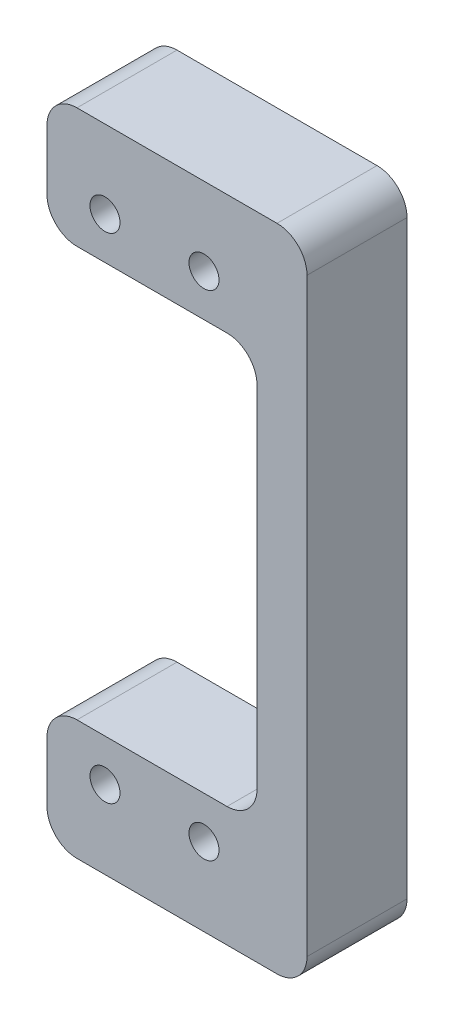
ISO-10303-21;
HEADER;
FILE_DESCRIPTION(('STEP AP214'),'2;1');
FILE_NAME('part.step','',(''),(''),'','','');
FILE_SCHEMA(('AUTOMOTIVE_DESIGN { 1 0 10303 214 1 1 1 1 }'));
ENDSEC;
DATA;
#1=APPLICATION_CONTEXT('core data for automotive mechanical design processes');
#2=APPLICATION_PROTOCOL_DEFINITION('international standard','automotive_design',2000,#1);
#3=PRODUCT_CONTEXT('',#1,'mechanical');
#4=PRODUCT('Part','Part','',(#3));
#5=PRODUCT_RELATED_PRODUCT_CATEGORY('part','',(#4));
#6=PRODUCT_DEFINITION_FORMATION('','',#4);
#7=PRODUCT_DEFINITION_CONTEXT('part definition',#1,'design');
#8=PRODUCT_DEFINITION('design','',#6,#7);
#9=PRODUCT_DEFINITION_SHAPE('','',#8);
#10=(LENGTH_UNIT() NAMED_UNIT(*) SI_UNIT(.MILLI.,.METRE.));
#11=(NAMED_UNIT(*) PLANE_ANGLE_UNIT() SI_UNIT($,.RADIAN.));
#12=(NAMED_UNIT(*) SI_UNIT($,.STERADIAN.) SOLID_ANGLE_UNIT());
#13=UNCERTAINTY_MEASURE_WITH_UNIT(LENGTH_MEASURE(1.E-05),#10,'distance_accuracy_value','');
#14=(GEOMETRIC_REPRESENTATION_CONTEXT(3) GLOBAL_UNCERTAINTY_ASSIGNED_CONTEXT((#13)) GLOBAL_UNIT_ASSIGNED_CONTEXT((#10,
#11,#12)) REPRESENTATION_CONTEXT('',''));
#15=CARTESIAN_POINT('',(0.,0.,0.));
#16=DIRECTION('',(0.,0.,1.));
#17=DIRECTION('',(1.,0.,0.));
#18=AXIS2_PLACEMENT_3D('',#15,#16,#17);
#19=CARTESIAN_POINT('',(-21.,-20.5,10.));
#20=DIRECTION('',(0.,-1.,0.));
#21=DIRECTION('',(1.,0.,0.));
#22=AXIS2_PLACEMENT_3D('',#19,#20,#21);
#23=PLANE('',#22);
#24=DIRECTION('',(-1.,0.,0.));
#25=VECTOR('',#24,1.);
#26=CARTESIAN_POINT('',(-21.,-20.5,0.));
#27=LINE('',#26,#25);
#28=CARTESIAN_POINT('',(-3.00000000000001,-20.5,0.));
#29=VERTEX_POINT('',#28);
#30=CARTESIAN_POINT('',(-18.,-20.5,0.));
#31=VERTEX_POINT('',#30);
#32=EDGE_CURVE('E265',#29,#31,#27,.T.);
#33=ORIENTED_EDGE('',*,*,#32,.T.);
#34=DIRECTION('',(0.,0.,-1.));
#35=VECTOR('',#34,1.);
#36=CARTESIAN_POINT('',(-18.,-20.5,10.));
#37=LINE('',#36,#35);
#38=CARTESIAN_POINT('',(-18.,-20.5,10.));
#39=VERTEX_POINT('',#38);
#40=EDGE_CURVE('E223',#31,#39,#37,.F.);
#41=ORIENTED_EDGE('',*,*,#40,.T.);
#42=DIRECTION('',(-1.,0.,0.));
#43=VECTOR('',#42,1.);
#44=CARTESIAN_POINT('',(-21.,-20.5,10.));
#45=LINE('',#44,#43);
#46=CARTESIAN_POINT('',(-3.00000000000001,-20.5,10.));
#47=VERTEX_POINT('',#46);
#48=EDGE_CURVE('E189',#47,#39,#45,.T.);
#49=ORIENTED_EDGE('',*,*,#48,.F.);
#50=DIRECTION('',(0.,0.,-1.));
#51=VECTOR('',#50,1.);
#52=CARTESIAN_POINT('',(-3.,-20.5,0.));
#53=LINE('',#52,#51);
#54=EDGE_CURVE('E220',#47,#29,#53,.T.);
#55=ORIENTED_EDGE('',*,*,#54,.T.);
#56=EDGE_LOOP('',(#33,#41,#49,#55));
#57=FACE_BOUND('',#56,.T.);
#58=ADVANCED_FACE('F33',(#57),#23,.F.);
#59=CARTESIAN_POINT('',(-21.,-32.5,10.));
#60=DIRECTION('',(1.,0.,0.));
#61=DIRECTION('',(0.,0.,-1.));
#62=AXIS2_PLACEMENT_3D('',#59,#60,#61);
#63=PLANE('',#62);
#64=DIRECTION('',(0.,-1.,0.));
#65=VECTOR('',#64,1.);
#66=CARTESIAN_POINT('',(-21.,-32.5,0.));
#67=LINE('',#66,#65);
#68=CARTESIAN_POINT('',(-21.,-23.5,0.));
#69=VERTEX_POINT('',#68);
#70=CARTESIAN_POINT('',(-21.,-29.5,0.));
#71=VERTEX_POINT('',#70);
#72=EDGE_CURVE('E178',#69,#71,#67,.T.);
#73=ORIENTED_EDGE('',*,*,#72,.T.);
#74=DIRECTION('',(0.,0.,-1.));
#75=VECTOR('',#74,1.);
#76=CARTESIAN_POINT('',(-21.,-29.5,10.));
#77=LINE('',#76,#75);
#78=CARTESIAN_POINT('',(-21.,-29.5,10.));
#79=VERTEX_POINT('',#78);
#80=EDGE_CURVE('E218',#71,#79,#77,.F.);
#81=ORIENTED_EDGE('',*,*,#80,.T.);
#82=DIRECTION('',(0.,-1.,0.));
#83=VECTOR('',#82,1.);
#84=CARTESIAN_POINT('',(-21.,-32.5,10.));
#85=LINE('',#84,#83);
#86=CARTESIAN_POINT('',(-21.,-23.5,10.));
#87=VERTEX_POINT('',#86);
#88=EDGE_CURVE('E284',#87,#79,#85,.T.);
#89=ORIENTED_EDGE('',*,*,#88,.F.);
#90=DIRECTION('',(0.,0.,-1.));
#91=VECTOR('',#90,1.);
#92=CARTESIAN_POINT('',(-21.,-23.5,10.));
#93=LINE('',#92,#91);
#94=EDGE_CURVE('E215',#87,#69,#93,.T.);
#95=ORIENTED_EDGE('',*,*,#94,.T.);
#96=EDGE_LOOP('',(#73,#81,#89,#95));
#97=FACE_BOUND('',#96,.T.);
#98=ADVANCED_FACE('F272',(#97),#63,.F.);
#99=CARTESIAN_POINT('',(5.00000000000001,-32.5,10.));
#100=DIRECTION('',(0.,1.,0.));
#101=DIRECTION('',(0.,0.,1.));
#102=AXIS2_PLACEMENT_3D('',#99,#100,#101);
#103=PLANE('',#102);
#104=DIRECTION('',(1.,0.,0.));
#105=VECTOR('',#104,1.);
#106=CARTESIAN_POINT('',(5.00000000000001,-32.5,0.));
#107=LINE('',#106,#105);
#108=CARTESIAN_POINT('',(-18.,-32.5,0.));
#109=VERTEX_POINT('',#108);
#110=CARTESIAN_POINT('',(2.00000000000001,-32.5,0.));
#111=VERTEX_POINT('',#110);
#112=EDGE_CURVE('E173',#109,#111,#107,.T.);
#113=ORIENTED_EDGE('',*,*,#112,.T.);
#114=DIRECTION('',(0.,0.,-1.));
#115=VECTOR('',#114,1.);
#116=CARTESIAN_POINT('',(2.00000000000001,-32.5,10.));
#117=LINE('',#116,#115);
#118=CARTESIAN_POINT('',(2.00000000000001,-32.5,10.));
#119=VERTEX_POINT('',#118);
#120=EDGE_CURVE('E151',#111,#119,#117,.F.);
#121=ORIENTED_EDGE('',*,*,#120,.T.);
#122=DIRECTION('',(1.,0.,0.));
#123=VECTOR('',#122,1.);
#124=CARTESIAN_POINT('',(5.00000000000001,-32.5,10.));
#125=LINE('',#124,#123);
#126=CARTESIAN_POINT('',(-18.,-32.5,10.));
#127=VERTEX_POINT('',#126);
#128=EDGE_CURVE('E283',#127,#119,#125,.T.);
#129=ORIENTED_EDGE('',*,*,#128,.F.);
#130=DIRECTION('',(0.,0.,-1.));
#131=VECTOR('',#130,1.);
#132=CARTESIAN_POINT('',(-18.,-32.5,10.));
#133=LINE('',#132,#131);
#134=EDGE_CURVE('E156',#127,#109,#133,.T.);
#135=ORIENTED_EDGE('',*,*,#134,.T.);
#136=EDGE_LOOP('',(#113,#121,#129,#135));
#137=FACE_BOUND('',#136,.T.);
#138=ADVANCED_FACE('F286',(#137),#103,.F.);
#139=CARTESIAN_POINT('',(5.00000000000001,32.5,10.));
#140=DIRECTION('',(-1.,0.,0.));
#141=DIRECTION('',(0.,0.,1.));
#142=AXIS2_PLACEMENT_3D('',#139,#140,#141);
#143=PLANE('',#142);
#144=DIRECTION('',(0.,1.,0.));
#145=VECTOR('',#144,1.);
#146=CARTESIAN_POINT('',(5.00000000000001,32.5,10.));
#147=LINE('',#146,#145);
#148=CARTESIAN_POINT('',(5.00000000000001,-29.5,10.));
#149=VERTEX_POINT('',#148);
#150=CARTESIAN_POINT('',(5.00000000000001,29.5,10.));
#151=VERTEX_POINT('',#150);
#152=EDGE_CURVE('E166',#149,#151,#147,.T.);
#153=ORIENTED_EDGE('',*,*,#152,.F.);
#154=DIRECTION('',(0.,0.,-1.));
#155=VECTOR('',#154,1.);
#156=CARTESIAN_POINT('',(5.00000000000001,-29.5,10.));
#157=LINE('',#156,#155);
#158=CARTESIAN_POINT('',(5.00000000000001,-29.5,0.));
#159=VERTEX_POINT('',#158);
#160=EDGE_CURVE('E150',#149,#159,#157,.T.);
#161=ORIENTED_EDGE('',*,*,#160,.T.);
#162=DIRECTION('',(0.,1.,0.));
#163=VECTOR('',#162,1.);
#164=CARTESIAN_POINT('',(5.00000000000001,32.5,0.));
#165=LINE('',#164,#163);
#166=CARTESIAN_POINT('',(5.00000000000001,29.5,0.));
#167=VERTEX_POINT('',#166);
#168=EDGE_CURVE('E163',#159,#167,#165,.T.);
#169=ORIENTED_EDGE('',*,*,#168,.T.);
#170=DIRECTION('',(0.,0.,-1.));
#171=VECTOR('',#170,1.);
#172=CARTESIAN_POINT('',(5.00000000000001,29.5,10.));
#173=LINE('',#172,#171);
#174=EDGE_CURVE('E168',#167,#151,#173,.F.);
#175=ORIENTED_EDGE('',*,*,#174,.T.);
#176=EDGE_LOOP('',(#153,#161,#169,#175));
#177=FACE_BOUND('',#176,.T.);
#178=ADVANCED_FACE('F162',(#177),#143,.F.);
#179=CARTESIAN_POINT('',(-21.,32.5,10.));
#180=DIRECTION('',(0.,-1.,0.));
#181=DIRECTION('',(0.,0.,-1.));
#182=AXIS2_PLACEMENT_3D('',#179,#180,#181);
#183=PLANE('',#182);
#184=DIRECTION('',(-1.,0.,0.));
#185=VECTOR('',#184,1.);
#186=CARTESIAN_POINT('',(-21.,32.5,0.));
#187=LINE('',#186,#185);
#188=CARTESIAN_POINT('',(2.,32.5,0.));
#189=VERTEX_POINT('',#188);
#190=CARTESIAN_POINT('',(-18.,32.5,0.));
#191=VERTEX_POINT('',#190);
#192=EDGE_CURVE('E172',#189,#191,#187,.T.);
#193=ORIENTED_EDGE('',*,*,#192,.T.);
#194=DIRECTION('',(0.,0.,-1.));
#195=VECTOR('',#194,1.);
#196=CARTESIAN_POINT('',(-18.,32.5,10.));
#197=LINE('',#196,#195);
#198=CARTESIAN_POINT('',(-18.,32.5,10.));
#199=VERTEX_POINT('',#198);
#200=EDGE_CURVE('E242',#191,#199,#197,.F.);
#201=ORIENTED_EDGE('',*,*,#200,.T.);
#202=DIRECTION('',(-1.,0.,0.));
#203=VECTOR('',#202,1.);
#204=CARTESIAN_POINT('',(-21.,32.5,10.));
#205=LINE('',#204,#203);
#206=CARTESIAN_POINT('',(2.,32.5,10.));
#207=VERTEX_POINT('',#206);
#208=EDGE_CURVE('E288',#207,#199,#205,.T.);
#209=ORIENTED_EDGE('',*,*,#208,.F.);
#210=DIRECTION('',(0.,0.,-1.));
#211=VECTOR('',#210,1.);
#212=CARTESIAN_POINT('',(2.00000000000001,32.5,10.));
#213=LINE('',#212,#211);
#214=EDGE_CURVE('E239',#207,#189,#213,.T.);
#215=ORIENTED_EDGE('',*,*,#214,.T.);
#216=EDGE_LOOP('',(#193,#201,#209,#215));
#217=FACE_BOUND('',#216,.T.);
#218=ADVANCED_FACE('F309',(#217),#183,.F.);
#219=CARTESIAN_POINT('',(-21.,20.5,10.));
#220=DIRECTION('',(1.,0.,0.));
#221=DIRECTION('',(0.,0.,-1.));
#222=AXIS2_PLACEMENT_3D('',#219,#220,#221);
#223=PLANE('',#222);
#224=DIRECTION('',(0.,-1.,0.));
#225=VECTOR('',#224,1.);
#226=CARTESIAN_POINT('',(-21.,20.5,0.));
#227=LINE('',#226,#225);
#228=CARTESIAN_POINT('',(-21.,29.5,0.));
#229=VERTEX_POINT('',#228);
#230=CARTESIAN_POINT('',(-21.,23.5,0.));
#231=VERTEX_POINT('',#230);
#232=EDGE_CURVE('E176',#229,#231,#227,.T.);
#233=ORIENTED_EDGE('',*,*,#232,.T.);
#234=DIRECTION('',(0.,0.,-1.));
#235=VECTOR('',#234,1.);
#236=CARTESIAN_POINT('',(-21.,23.5,10.));
#237=LINE('',#236,#235);
#238=CARTESIAN_POINT('',(-21.,23.5,10.));
#239=VERTEX_POINT('',#238);
#240=EDGE_CURVE('E237',#231,#239,#237,.F.);
#241=ORIENTED_EDGE('',*,*,#240,.T.);
#242=DIRECTION('',(0.,-1.,0.));
#243=VECTOR('',#242,1.);
#244=CARTESIAN_POINT('',(-21.,20.5,10.));
#245=LINE('',#244,#243);
#246=CARTESIAN_POINT('',(-21.,29.5,10.));
#247=VERTEX_POINT('',#246);
#248=EDGE_CURVE('E261',#247,#239,#245,.T.);
#249=ORIENTED_EDGE('',*,*,#248,.F.);
#250=DIRECTION('',(0.,0.,-1.));
#251=VECTOR('',#250,1.);
#252=CARTESIAN_POINT('',(-21.,29.5,10.));
#253=LINE('',#252,#251);
#254=EDGE_CURVE('E234',#247,#229,#253,.T.);
#255=ORIENTED_EDGE('',*,*,#254,.T.);
#256=EDGE_LOOP('',(#233,#241,#249,#255));
#257=FACE_BOUND('',#256,.T.);
#258=ADVANCED_FACE('F304',(#257),#223,.F.);
#259=CARTESIAN_POINT('',(0.,20.5,10.));
#260=DIRECTION('',(0.,1.,0.));
#261=DIRECTION('',(-1.,0.,0.));
#262=AXIS2_PLACEMENT_3D('',#259,#260,#261);
#263=PLANE('',#262);
#264=DIRECTION('',(1.,0.,0.));
#265=VECTOR('',#264,1.);
#266=CARTESIAN_POINT('',(0.,20.5,0.));
#267=LINE('',#266,#265);
#268=CARTESIAN_POINT('',(-18.,20.5,0.));
#269=VERTEX_POINT('',#268);
#270=CARTESIAN_POINT('',(-3.,20.5,0.));
#271=VERTEX_POINT('',#270);
#272=EDGE_CURVE('E184',#269,#271,#267,.T.);
#273=ORIENTED_EDGE('',*,*,#272,.T.);
#274=DIRECTION('',(0.,0.,-1.));
#275=VECTOR('',#274,1.);
#276=CARTESIAN_POINT('',(-3.,20.5,10.));
#277=LINE('',#276,#275);
#278=CARTESIAN_POINT('',(-3.,20.5,10.));
#279=VERTEX_POINT('',#278);
#280=EDGE_CURVE('E232',#271,#279,#277,.F.);
#281=ORIENTED_EDGE('',*,*,#280,.T.);
#282=DIRECTION('',(1.,0.,0.));
#283=VECTOR('',#282,1.);
#284=CARTESIAN_POINT('',(0.,20.5,10.));
#285=LINE('',#284,#283);
#286=CARTESIAN_POINT('',(-18.,20.5,10.));
#287=VERTEX_POINT('',#286);
#288=EDGE_CURVE('E259',#287,#279,#285,.T.);
#289=ORIENTED_EDGE('',*,*,#288,.F.);
#290=DIRECTION('',(0.,0.,-1.));
#291=VECTOR('',#290,1.);
#292=CARTESIAN_POINT('',(-18.,20.5,10.));
#293=LINE('',#292,#291);
#294=EDGE_CURVE('E229',#287,#269,#293,.T.);
#295=ORIENTED_EDGE('',*,*,#294,.T.);
#296=EDGE_LOOP('',(#273,#281,#289,#295));
#297=FACE_BOUND('',#296,.T.);
#298=ADVANCED_FACE('F253',(#297),#263,.F.);
#299=CARTESIAN_POINT('',(0.,-20.5,10.));
#300=DIRECTION('',(1.,0.,0.));
#301=DIRECTION('',(0.,0.,-1.));
#302=AXIS2_PLACEMENT_3D('',#299,#300,#301);
#303=PLANE('',#302);
#304=DIRECTION('',(0.,-1.,0.));
#305=VECTOR('',#304,1.);
#306=CARTESIAN_POINT('',(0.,-20.5,0.));
#307=LINE('',#306,#305);
#308=CARTESIAN_POINT('',(0.,17.5,0.));
#309=VERTEX_POINT('',#308);
#310=CARTESIAN_POINT('',(0.,-17.5,0.));
#311=VERTEX_POINT('',#310);
#312=EDGE_CURVE('E187',#309,#311,#307,.T.);
#313=ORIENTED_EDGE('',*,*,#312,.T.);
#314=DIRECTION('',(0.,0.,-1.));
#315=VECTOR('',#314,1.);
#316=CARTESIAN_POINT('',(0.,-17.5,10.));
#317=LINE('',#316,#315);
#318=CARTESIAN_POINT('',(0.,-17.5,10.));
#319=VERTEX_POINT('',#318);
#320=EDGE_CURVE('E48',#311,#319,#317,.F.);
#321=ORIENTED_EDGE('',*,*,#320,.T.);
#322=DIRECTION('',(0.,-1.,0.));
#323=VECTOR('',#322,1.);
#324=CARTESIAN_POINT('',(0.,-20.5,10.));
#325=LINE('',#324,#323);
#326=CARTESIAN_POINT('',(0.,17.5,10.));
#327=VERTEX_POINT('',#326);
#328=EDGE_CURVE('E190',#327,#319,#325,.T.);
#329=ORIENTED_EDGE('',*,*,#328,.F.);
#330=DIRECTION('',(0.,0.,-1.));
#331=VECTOR('',#330,1.);
#332=CARTESIAN_POINT('',(0.,17.5,0.));
#333=LINE('',#332,#331);
#334=EDGE_CURVE('E225',#327,#309,#333,.T.);
#335=ORIENTED_EDGE('',*,*,#334,.T.);
#336=EDGE_LOOP('',(#313,#321,#329,#335));
#337=FACE_BOUND('',#336,.T.);
#338=ADVANCED_FACE('F257',(#337),#303,.F.);
#339=CARTESIAN_POINT('',(0.,0.,10.));
#340=DIRECTION('',(0.,0.,1.));
#341=DIRECTION('',(1.,0.,0.));
#342=AXIS2_PLACEMENT_3D('',#339,#340,#341);
#343=PLANE('',#342);
#344=CARTESIAN_POINT('',(-5.3,-24.695,10.));
#345=DIRECTION('',(0.,0.,1.));
#346=DIRECTION('',(1.,0.,0.));
#347=AXIS2_PLACEMENT_3D('',#344,#345,#346);
#348=CIRCLE('',#347,1.5);
#349=CARTESIAN_POINT('',(-3.8,-24.695,10.));
#350=VERTEX_POINT('',#349);
#351=EDGE_CURVE('E509',#350,#350,#348,.T.);
#352=ORIENTED_EDGE('',*,*,#351,.F.);
#353=EDGE_LOOP('',(#352));
#354=FACE_BOUND('',#353,.T.);
#355=CARTESIAN_POINT('',(-15.2,-24.695,10.));
#356=DIRECTION('',(0.,0.,1.));
#357=DIRECTION('',(1.,0.,0.));
#358=AXIS2_PLACEMENT_3D('',#355,#356,#357);
#359=CIRCLE('',#358,1.5);
#360=CARTESIAN_POINT('',(-13.7,-24.695,10.));
#361=VERTEX_POINT('',#360);
#362=EDGE_CURVE('E511',#361,#361,#359,.T.);
#363=ORIENTED_EDGE('',*,*,#362,.F.);
#364=EDGE_LOOP('',(#363));
#365=FACE_BOUND('',#364,.T.);
#366=CARTESIAN_POINT('',(-5.3,24.695,10.));
#367=DIRECTION('',(0.,0.,1.));
#368=DIRECTION('',(1.,0.,0.));
#369=AXIS2_PLACEMENT_3D('',#366,#367,#368);
#370=CIRCLE('',#369,1.5);
#371=CARTESIAN_POINT('',(-3.8,24.695,10.));
#372=VERTEX_POINT('',#371);
#373=EDGE_CURVE('E519',#372,#372,#370,.T.);
#374=ORIENTED_EDGE('',*,*,#373,.F.);
#375=EDGE_LOOP('',(#374));
#376=FACE_BOUND('',#375,.T.);
#377=CARTESIAN_POINT('',(-15.2,24.695,10.));
#378=DIRECTION('',(0.,0.,1.));
#379=DIRECTION('',(1.,0.,0.));
#380=AXIS2_PLACEMENT_3D('',#377,#378,#379);
#381=CIRCLE('',#380,1.5);
#382=CARTESIAN_POINT('',(-13.7,24.695,10.));
#383=VERTEX_POINT('',#382);
#384=EDGE_CURVE('E525',#383,#383,#381,.T.);
#385=ORIENTED_EDGE('',*,*,#384,.F.);
#386=EDGE_LOOP('',(#385));
#387=FACE_BOUND('',#386,.T.);
#388=ORIENTED_EDGE('',*,*,#128,.T.);
#389=CARTESIAN_POINT('',(2.00000000000001,-29.5,10.));
#390=DIRECTION('',(0.,0.,1.));
#391=DIRECTION('',(1.,0.,0.));
#392=AXIS2_PLACEMENT_3D('',#389,#390,#391);
#393=CIRCLE('',#392,3.);
#394=EDGE_CURVE('E213',#119,#149,#393,.T.);
#395=ORIENTED_EDGE('',*,*,#394,.T.);
#396=ORIENTED_EDGE('',*,*,#152,.T.);
#397=CARTESIAN_POINT('',(2.00000000000001,29.5,10.));
#398=DIRECTION('',(0.,0.,1.));
#399=DIRECTION('',(1.,0.,0.));
#400=AXIS2_PLACEMENT_3D('',#397,#398,#399);
#401=CIRCLE('',#400,3.);
#402=EDGE_CURVE('E203',#151,#207,#401,.T.);
#403=ORIENTED_EDGE('',*,*,#402,.T.);
#404=ORIENTED_EDGE('',*,*,#208,.T.);
#405=CARTESIAN_POINT('',(-18.,29.5,10.));
#406=DIRECTION('',(0.,0.,1.));
#407=DIRECTION('',(1.,0.,0.));
#408=AXIS2_PLACEMENT_3D('',#405,#406,#407);
#409=CIRCLE('',#408,3.);
#410=EDGE_CURVE('E205',#199,#247,#409,.T.);
#411=ORIENTED_EDGE('',*,*,#410,.T.);
#412=ORIENTED_EDGE('',*,*,#248,.T.);
#413=CARTESIAN_POINT('',(-18.,23.5,10.));
#414=DIRECTION('',(0.,0.,1.));
#415=DIRECTION('',(1.,0.,0.));
#416=AXIS2_PLACEMENT_3D('',#413,#414,#415);
#417=CIRCLE('',#416,3.);
#418=EDGE_CURVE('E207',#239,#287,#417,.T.);
#419=ORIENTED_EDGE('',*,*,#418,.T.);
#420=ORIENTED_EDGE('',*,*,#288,.T.);
#421=CARTESIAN_POINT('',(-3.,17.5,10.));
#422=DIRECTION('',(0.,0.,1.));
#423=DIRECTION('',(1.,0.,0.));
#424=AXIS2_PLACEMENT_3D('',#421,#422,#423);
#425=CIRCLE('',#424,3.);
#426=EDGE_CURVE('E11',#279,#327,#425,.F.);
#427=ORIENTED_EDGE('',*,*,#426,.T.);
#428=ORIENTED_EDGE('',*,*,#328,.T.);
#429=CARTESIAN_POINT('',(-3.,-17.5,10.));
#430=DIRECTION('',(0.,0.,1.));
#431=DIRECTION('',(1.,0.,0.));
#432=AXIS2_PLACEMENT_3D('',#429,#430,#431);
#433=CIRCLE('',#432,3.);
#434=EDGE_CURVE('E246',#319,#47,#433,.F.);
#435=ORIENTED_EDGE('',*,*,#434,.T.);
#436=ORIENTED_EDGE('',*,*,#48,.T.);
#437=CARTESIAN_POINT('',(-18.,-23.5,10.));
#438=DIRECTION('',(0.,0.,1.));
#439=DIRECTION('',(1.,0.,0.));
#440=AXIS2_PLACEMENT_3D('',#437,#438,#439);
#441=CIRCLE('',#440,3.);
#442=EDGE_CURVE('E209',#39,#87,#441,.T.);
#443=ORIENTED_EDGE('',*,*,#442,.T.);
#444=ORIENTED_EDGE('',*,*,#88,.T.);
#445=CARTESIAN_POINT('',(-18.,-29.5,10.));
#446=DIRECTION('',(0.,0.,1.));
#447=DIRECTION('',(1.,0.,0.));
#448=AXIS2_PLACEMENT_3D('',#445,#446,#447);
#449=CIRCLE('',#448,3.);
#450=EDGE_CURVE('E211',#79,#127,#449,.T.);
#451=ORIENTED_EDGE('',*,*,#450,.T.);
#452=EDGE_LOOP('',(#388,#395,#396,#403,#404,#411,#412,#419,#420,#427,#428,#435,#436,#443,#444,#451));
#453=FACE_BOUND('',#452,.T.);
#454=ADVANCED_FACE('F282',(#354,#365,#376,#387,#453),#343,.T.);
#455=CARTESIAN_POINT('',(0.,0.,0.));
#456=DIRECTION('',(0.,0.,1.));
#457=DIRECTION('',(1.,0.,0.));
#458=AXIS2_PLACEMENT_3D('',#455,#456,#457);
#459=PLANE('',#458);
#460=CARTESIAN_POINT('',(-5.3,-24.695,0.));
#461=DIRECTION('',(0.,0.,1.));
#462=DIRECTION('',(1.,0.,0.));
#463=AXIS2_PLACEMENT_3D('',#460,#461,#462);
#464=CIRCLE('',#463,1.5);
#465=CARTESIAN_POINT('',(-3.8,-24.695,0.));
#466=VERTEX_POINT('',#465);
#467=EDGE_CURVE('E506',#466,#466,#464,.T.);
#468=ORIENTED_EDGE('',*,*,#467,.T.);
#469=EDGE_LOOP('',(#468));
#470=FACE_BOUND('',#469,.T.);
#471=CARTESIAN_POINT('',(-15.2,-24.695,0.));
#472=DIRECTION('',(0.,0.,1.));
#473=DIRECTION('',(1.,0.,0.));
#474=AXIS2_PLACEMENT_3D('',#471,#472,#473);
#475=CIRCLE('',#474,1.5);
#476=CARTESIAN_POINT('',(-13.7,-24.695,0.));
#477=VERTEX_POINT('',#476);
#478=EDGE_CURVE('E516',#477,#477,#475,.T.);
#479=ORIENTED_EDGE('',*,*,#478,.T.);
#480=EDGE_LOOP('',(#479));
#481=FACE_BOUND('',#480,.T.);
#482=CARTESIAN_POINT('',(-5.3,24.695,0.));
#483=DIRECTION('',(0.,0.,1.));
#484=DIRECTION('',(1.,0.,0.));
#485=AXIS2_PLACEMENT_3D('',#482,#483,#484);
#486=CIRCLE('',#485,1.5);
#487=CARTESIAN_POINT('',(-3.8,24.695,0.));
#488=VERTEX_POINT('',#487);
#489=EDGE_CURVE('E522',#488,#488,#486,.T.);
#490=ORIENTED_EDGE('',*,*,#489,.T.);
#491=EDGE_LOOP('',(#490));
#492=FACE_BOUND('',#491,.T.);
#493=CARTESIAN_POINT('',(-15.2,24.695,0.));
#494=DIRECTION('',(0.,0.,1.));
#495=DIRECTION('',(1.,0.,0.));
#496=AXIS2_PLACEMENT_3D('',#493,#494,#495);
#497=CIRCLE('',#496,1.5);
#498=CARTESIAN_POINT('',(-13.7,24.695,0.));
#499=VERTEX_POINT('',#498);
#500=EDGE_CURVE('E267',#499,#499,#497,.T.);
#501=ORIENTED_EDGE('',*,*,#500,.T.);
#502=EDGE_LOOP('',(#501));
#503=FACE_BOUND('',#502,.T.);
#504=ORIENTED_EDGE('',*,*,#168,.F.);
#505=CARTESIAN_POINT('',(2.00000000000001,-29.5,0.));
#506=DIRECTION('',(0.,0.,1.));
#507=DIRECTION('',(1.,0.,0.));
#508=AXIS2_PLACEMENT_3D('',#505,#506,#507);
#509=CIRCLE('',#508,3.);
#510=EDGE_CURVE('E146',#159,#111,#509,.F.);
#511=ORIENTED_EDGE('',*,*,#510,.T.);
#512=ORIENTED_EDGE('',*,*,#112,.F.);
#513=CARTESIAN_POINT('',(-18.,-29.5,0.));
#514=DIRECTION('',(0.,0.,1.));
#515=DIRECTION('',(1.,0.,0.));
#516=AXIS2_PLACEMENT_3D('',#513,#514,#515);
#517=CIRCLE('',#516,3.);
#518=EDGE_CURVE('E157',#109,#71,#517,.F.);
#519=ORIENTED_EDGE('',*,*,#518,.T.);
#520=ORIENTED_EDGE('',*,*,#72,.F.);
#521=CARTESIAN_POINT('',(-18.,-23.5,0.));
#522=DIRECTION('',(0.,0.,1.));
#523=DIRECTION('',(1.,0.,0.));
#524=AXIS2_PLACEMENT_3D('',#521,#522,#523);
#525=CIRCLE('',#524,3.);
#526=EDGE_CURVE('E197',#69,#31,#525,.F.);
#527=ORIENTED_EDGE('',*,*,#526,.T.);
#528=ORIENTED_EDGE('',*,*,#32,.F.);
#529=CARTESIAN_POINT('',(-3.,-17.5,0.));
#530=DIRECTION('',(0.,0.,1.));
#531=DIRECTION('',(1.,0.,0.));
#532=AXIS2_PLACEMENT_3D('',#529,#530,#531);
#533=CIRCLE('',#532,3.);
#534=EDGE_CURVE('E244',#29,#311,#533,.T.);
#535=ORIENTED_EDGE('',*,*,#534,.T.);
#536=ORIENTED_EDGE('',*,*,#312,.F.);
#537=CARTESIAN_POINT('',(-3.,17.5,0.));
#538=DIRECTION('',(0.,0.,1.));
#539=DIRECTION('',(1.,0.,0.));
#540=AXIS2_PLACEMENT_3D('',#537,#538,#539);
#541=CIRCLE('',#540,3.);
#542=EDGE_CURVE('E41',#309,#271,#541,.T.);
#543=ORIENTED_EDGE('',*,*,#542,.T.);
#544=ORIENTED_EDGE('',*,*,#272,.F.);
#545=CARTESIAN_POINT('',(-18.,23.5,0.));
#546=DIRECTION('',(0.,0.,1.));
#547=DIRECTION('',(1.,0.,0.));
#548=AXIS2_PLACEMENT_3D('',#545,#546,#547);
#549=CIRCLE('',#548,3.);
#550=EDGE_CURVE('E195',#269,#231,#549,.F.);
#551=ORIENTED_EDGE('',*,*,#550,.T.);
#552=ORIENTED_EDGE('',*,*,#232,.F.);
#553=CARTESIAN_POINT('',(-18.,29.5,0.));
#554=DIRECTION('',(0.,0.,1.));
#555=DIRECTION('',(1.,0.,0.));
#556=AXIS2_PLACEMENT_3D('',#553,#554,#555);
#557=CIRCLE('',#556,3.);
#558=EDGE_CURVE('E193',#229,#191,#557,.F.);
#559=ORIENTED_EDGE('',*,*,#558,.T.);
#560=ORIENTED_EDGE('',*,*,#192,.F.);
#561=CARTESIAN_POINT('',(2.00000000000001,29.5,0.));
#562=DIRECTION('',(0.,0.,1.));
#563=DIRECTION('',(1.,0.,0.));
#564=AXIS2_PLACEMENT_3D('',#561,#562,#563);
#565=CIRCLE('',#564,3.);
#566=EDGE_CURVE('E167',#189,#167,#565,.F.);
#567=ORIENTED_EDGE('',*,*,#566,.T.);
#568=EDGE_LOOP('',(#504,#511,#512,#519,#520,#527,#528,#535,#536,#543,#544,#551,#552,#559,#560,#567));
#569=FACE_BOUND('',#568,.T.);
#570=ADVANCED_FACE('F170',(#470,#481,#492,#503,#569),#459,.F.);
#571=CARTESIAN_POINT('',(2.00000000000001,-29.5,10.));
#572=DIRECTION('',(0.,0.,-1.));
#573=DIRECTION('',(-1.,0.,0.));
#574=AXIS2_PLACEMENT_3D('',#571,#572,#573);
#575=CYLINDRICAL_SURFACE('',#574,3.);
#576=ORIENTED_EDGE('',*,*,#394,.F.);
#577=ORIENTED_EDGE('',*,*,#120,.F.);
#578=ORIENTED_EDGE('',*,*,#510,.F.);
#579=ORIENTED_EDGE('',*,*,#160,.F.);
#580=EDGE_LOOP('',(#576,#577,#578,#579));
#581=FACE_BOUND('',#580,.T.);
#582=ADVANCED_FACE('F149',(#581),#575,.T.);
#583=CARTESIAN_POINT('',(-18.,-29.5,10.));
#584=DIRECTION('',(0.,0.,-1.));
#585=DIRECTION('',(-1.,0.,0.));
#586=AXIS2_PLACEMENT_3D('',#583,#584,#585);
#587=CYLINDRICAL_SURFACE('',#586,3.);
#588=ORIENTED_EDGE('',*,*,#450,.F.);
#589=ORIENTED_EDGE('',*,*,#80,.F.);
#590=ORIENTED_EDGE('',*,*,#518,.F.);
#591=ORIENTED_EDGE('',*,*,#134,.F.);
#592=EDGE_LOOP('',(#588,#589,#590,#591));
#593=FACE_BOUND('',#592,.T.);
#594=ADVANCED_FACE('F278',(#593),#587,.T.);
#595=CARTESIAN_POINT('',(-18.,-23.5,10.));
#596=DIRECTION('',(0.,0.,-1.));
#597=DIRECTION('',(-1.,0.,0.));
#598=AXIS2_PLACEMENT_3D('',#595,#596,#597);
#599=CYLINDRICAL_SURFACE('',#598,3.);
#600=ORIENTED_EDGE('',*,*,#442,.F.);
#601=ORIENTED_EDGE('',*,*,#40,.F.);
#602=ORIENTED_EDGE('',*,*,#526,.F.);
#603=ORIENTED_EDGE('',*,*,#94,.F.);
#604=EDGE_LOOP('',(#600,#601,#602,#603));
#605=FACE_BOUND('',#604,.T.);
#606=ADVANCED_FACE('F336',(#605),#599,.T.);
#607=CARTESIAN_POINT('',(-3.,-17.5,10.));
#608=DIRECTION('',(0.,0.,1.));
#609=DIRECTION('',(1.,0.,0.));
#610=AXIS2_PLACEMENT_3D('',#607,#608,#609);
#611=CYLINDRICAL_SURFACE('',#610,3.);
#612=ORIENTED_EDGE('',*,*,#434,.F.);
#613=ORIENTED_EDGE('',*,*,#320,.F.);
#614=ORIENTED_EDGE('',*,*,#534,.F.);
#615=ORIENTED_EDGE('',*,*,#54,.F.);
#616=EDGE_LOOP('',(#612,#613,#614,#615));
#617=FACE_BOUND('',#616,.T.);
#618=ADVANCED_FACE('F339',(#617),#611,.F.);
#619=CARTESIAN_POINT('',(-3.,17.5,10.));
#620=DIRECTION('',(0.,0.,1.));
#621=DIRECTION('',(1.,0.,0.));
#622=AXIS2_PLACEMENT_3D('',#619,#620,#621);
#623=CYLINDRICAL_SURFACE('',#622,3.);
#624=ORIENTED_EDGE('',*,*,#426,.F.);
#625=ORIENTED_EDGE('',*,*,#280,.F.);
#626=ORIENTED_EDGE('',*,*,#542,.F.);
#627=ORIENTED_EDGE('',*,*,#334,.F.);
#628=EDGE_LOOP('',(#624,#625,#626,#627));
#629=FACE_BOUND('',#628,.T.);
#630=ADVANCED_FACE('F256',(#629),#623,.F.);
#631=CARTESIAN_POINT('',(-18.,23.5,10.));
#632=DIRECTION('',(0.,0.,-1.));
#633=DIRECTION('',(-1.,0.,0.));
#634=AXIS2_PLACEMENT_3D('',#631,#632,#633);
#635=CYLINDRICAL_SURFACE('',#634,3.);
#636=ORIENTED_EDGE('',*,*,#418,.F.);
#637=ORIENTED_EDGE('',*,*,#240,.F.);
#638=ORIENTED_EDGE('',*,*,#550,.F.);
#639=ORIENTED_EDGE('',*,*,#294,.F.);
#640=EDGE_LOOP('',(#636,#637,#638,#639));
#641=FACE_BOUND('',#640,.T.);
#642=ADVANCED_FACE('F302',(#641),#635,.T.);
#643=CARTESIAN_POINT('',(-18.,29.5,10.));
#644=DIRECTION('',(0.,0.,-1.));
#645=DIRECTION('',(-1.,0.,0.));
#646=AXIS2_PLACEMENT_3D('',#643,#644,#645);
#647=CYLINDRICAL_SURFACE('',#646,3.);
#648=ORIENTED_EDGE('',*,*,#410,.F.);
#649=ORIENTED_EDGE('',*,*,#200,.F.);
#650=ORIENTED_EDGE('',*,*,#558,.F.);
#651=ORIENTED_EDGE('',*,*,#254,.F.);
#652=EDGE_LOOP('',(#648,#649,#650,#651));
#653=FACE_BOUND('',#652,.T.);
#654=ADVANCED_FACE('F306',(#653),#647,.T.);
#655=CARTESIAN_POINT('',(2.00000000000001,29.5,10.));
#656=DIRECTION('',(0.,0.,-1.));
#657=DIRECTION('',(-1.,0.,0.));
#658=AXIS2_PLACEMENT_3D('',#655,#656,#657);
#659=CYLINDRICAL_SURFACE('',#658,3.);
#660=ORIENTED_EDGE('',*,*,#402,.F.);
#661=ORIENTED_EDGE('',*,*,#174,.F.);
#662=ORIENTED_EDGE('',*,*,#566,.F.);
#663=ORIENTED_EDGE('',*,*,#214,.F.);
#664=EDGE_LOOP('',(#660,#661,#662,#663));
#665=FACE_BOUND('',#664,.T.);
#666=ADVANCED_FACE('F35',(#665),#659,.T.);
#667=CARTESIAN_POINT('',(-15.2,24.695,10.));
#668=DIRECTION('',(0.,0.,1.));
#669=DIRECTION('',(1.,0.,0.));
#670=AXIS2_PLACEMENT_3D('',#667,#668,#669);
#671=CYLINDRICAL_SURFACE('',#670,1.5);
#672=ORIENTED_EDGE('',*,*,#500,.F.);
#673=EDGE_LOOP('',(#672));
#674=FACE_BOUND('',#673,.T.);
#675=ORIENTED_EDGE('',*,*,#384,.T.);
#676=EDGE_LOOP('',(#675));
#677=FACE_BOUND('',#676,.T.);
#678=ADVANCED_FACE('F315',(#674,#677),#671,.F.);
#679=CARTESIAN_POINT('',(-5.3,24.695,10.));
#680=DIRECTION('',(0.,0.,1.));
#681=DIRECTION('',(1.,0.,0.));
#682=AXIS2_PLACEMENT_3D('',#679,#680,#681);
#683=CYLINDRICAL_SURFACE('',#682,1.5);
#684=ORIENTED_EDGE('',*,*,#489,.F.);
#685=EDGE_LOOP('',(#684));
#686=FACE_BOUND('',#685,.T.);
#687=ORIENTED_EDGE('',*,*,#373,.T.);
#688=EDGE_LOOP('',(#687));
#689=FACE_BOUND('',#688,.T.);
#690=ADVANCED_FACE('F320',(#686,#689),#683,.F.);
#691=CARTESIAN_POINT('',(-15.2,-24.695,10.));
#692=DIRECTION('',(0.,0.,1.));
#693=DIRECTION('',(1.,0.,0.));
#694=AXIS2_PLACEMENT_3D('',#691,#692,#693);
#695=CYLINDRICAL_SURFACE('',#694,1.5);
#696=ORIENTED_EDGE('',*,*,#478,.F.);
#697=EDGE_LOOP('',(#696));
#698=FACE_BOUND('',#697,.T.);
#699=ORIENTED_EDGE('',*,*,#362,.T.);
#700=EDGE_LOOP('',(#699));
#701=FACE_BOUND('',#700,.T.);
#702=ADVANCED_FACE('F374',(#698,#701),#695,.F.);
#703=CARTESIAN_POINT('',(-5.3,-24.695,10.));
#704=DIRECTION('',(0.,0.,1.));
#705=DIRECTION('',(1.,0.,0.));
#706=AXIS2_PLACEMENT_3D('',#703,#704,#705);
#707=CYLINDRICAL_SURFACE('',#706,1.5);
#708=ORIENTED_EDGE('',*,*,#467,.F.);
#709=EDGE_LOOP('',(#708));
#710=FACE_BOUND('',#709,.T.);
#711=ORIENTED_EDGE('',*,*,#351,.T.);
#712=EDGE_LOOP('',(#711));
#713=FACE_BOUND('',#712,.T.);
#714=ADVANCED_FACE('F399',(#710,#713),#707,.F.);
#715=CLOSED_SHELL('',(#58,#98,#138,#178,#218,#258,#298,#338,#454,#570,#582,#594,#606,#618,#630,
#642,#654,#666,#678,#690,#702,#714));
#716=MANIFOLD_SOLID_BREP('B2',#715);
#717=ADVANCED_BREP_SHAPE_REPRESENTATION('',(#18,#716),#14);
#718=SHAPE_DEFINITION_REPRESENTATION(#9,#717);
ENDSEC;
END-ISO-10303-21;
